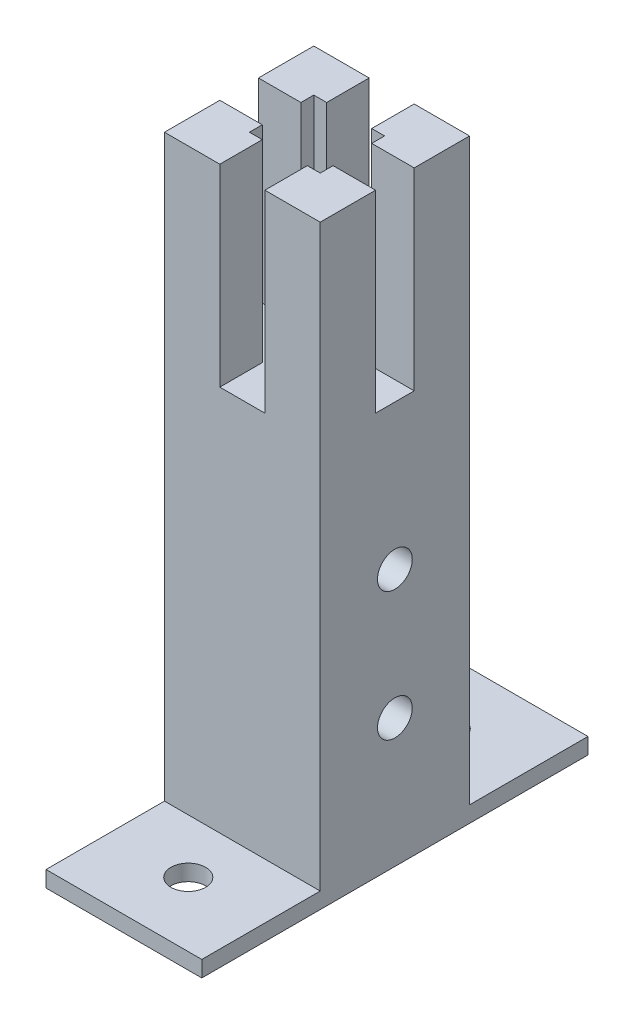
ISO-10303-21;
HEADER;
FILE_DESCRIPTION(('STEP AP214'),'2;1');
FILE_NAME('part.step','',(''),(''),'','','');
FILE_SCHEMA(('AUTOMOTIVE_DESIGN { 1 0 10303 214 1 1 1 1 }'));
ENDSEC;
DATA;
#1=APPLICATION_CONTEXT('core data for automotive mechanical design processes');
#2=APPLICATION_PROTOCOL_DEFINITION('international standard','automotive_design',2000,#1);
#3=PRODUCT_CONTEXT('',#1,'mechanical');
#4=PRODUCT('Part','Part','',(#3));
#5=PRODUCT_RELATED_PRODUCT_CATEGORY('part','',(#4));
#6=PRODUCT_DEFINITION_FORMATION('','',#4);
#7=PRODUCT_DEFINITION_CONTEXT('part definition',#1,'design');
#8=PRODUCT_DEFINITION('design','',#6,#7);
#9=PRODUCT_DEFINITION_SHAPE('','',#8);
#10=(LENGTH_UNIT() NAMED_UNIT(*) SI_UNIT(.MILLI.,.METRE.));
#11=(NAMED_UNIT(*) PLANE_ANGLE_UNIT() SI_UNIT($,.RADIAN.));
#12=(NAMED_UNIT(*) SI_UNIT($,.STERADIAN.) SOLID_ANGLE_UNIT());
#13=UNCERTAINTY_MEASURE_WITH_UNIT(LENGTH_MEASURE(1.E-05),#10,'distance_accuracy_value','');
#14=(GEOMETRIC_REPRESENTATION_CONTEXT(3) GLOBAL_UNCERTAINTY_ASSIGNED_CONTEXT((#13)) GLOBAL_UNIT_ASSIGNED_CONTEXT((#10,
#11,#12)) REPRESENTATION_CONTEXT('',''));
#15=CARTESIAN_POINT('',(0.,0.,0.));
#16=DIRECTION('',(0.,0.,1.));
#17=DIRECTION('',(1.,0.,0.));
#18=AXIS2_PLACEMENT_3D('',#15,#16,#17);
#19=CARTESIAN_POINT('',(0.,0.,0.));
#20=DIRECTION('',(0.,-1.,0.));
#21=DIRECTION('',(0.,0.,-1.));
#22=AXIS2_PLACEMENT_3D('',#19,#20,#21);
#23=PLANE('',#22);
#24=DIRECTION('',(0.,0.,1.));
#25=VECTOR('',#24,1.);
#26=CARTESIAN_POINT('',(4.445,0.,14.732));
#27=LINE('',#26,#25);
#28=CARTESIAN_POINT('',(4.445,0.,6.35));
#29=VERTEX_POINT('',#28);
#30=CARTESIAN_POINT('',(4.445,0.,14.732));
#31=VERTEX_POINT('',#30);
#32=EDGE_CURVE('E249',#29,#31,#27,.T.);
#33=ORIENTED_EDGE('',*,*,#32,.F.);
#34=DIRECTION('',(-1.,0.,0.));
#35=VECTOR('',#34,1.);
#36=CARTESIAN_POINT('',(4.445,0.,6.35));
#37=LINE('',#36,#35);
#38=CARTESIAN_POINT('',(6.985,0.,6.35));
#39=VERTEX_POINT('',#38);
#40=EDGE_CURVE('E246',#39,#29,#37,.T.);
#41=ORIENTED_EDGE('',*,*,#40,.F.);
#42=DIRECTION('',(0.,0.,1.));
#43=VECTOR('',#42,1.);
#44=CARTESIAN_POINT('',(6.985,0.,6.35));
#45=LINE('',#44,#43);
#46=CARTESIAN_POINT('',(6.985,0.,3.81));
#47=VERTEX_POINT('',#46);
#48=EDGE_CURVE('E259',#47,#39,#45,.T.);
#49=ORIENTED_EDGE('',*,*,#48,.F.);
#50=DIRECTION('',(-1.,0.,0.));
#51=VECTOR('',#50,1.);
#52=CARTESIAN_POINT('',(6.985,0.,3.81));
#53=LINE('',#52,#51);
#54=CARTESIAN_POINT('',(15.367,0.,3.81));
#55=VERTEX_POINT('',#54);
#56=EDGE_CURVE('E272',#55,#47,#53,.T.);
#57=ORIENTED_EDGE('',*,*,#56,.F.);
#58=DIRECTION('',(0.,0.,1.));
#59=VECTOR('',#58,1.);
#60=CARTESIAN_POINT('',(15.367,0.,14.732));
#61=LINE('',#60,#59);
#62=CARTESIAN_POINT('',(15.367,0.,-3.81));
#63=VERTEX_POINT('',#62);
#64=EDGE_CURVE('E372',#63,#55,#61,.T.);
#65=ORIENTED_EDGE('',*,*,#64,.F.);
#66=DIRECTION('',(1.,0.,0.));
#67=VECTOR('',#66,1.);
#68=CARTESIAN_POINT('',(6.985,0.,-3.81));
#69=LINE('',#68,#67);
#70=CARTESIAN_POINT('',(6.985,0.,-3.81));
#71=VERTEX_POINT('',#70);
#72=EDGE_CURVE('E402',#71,#63,#69,.T.);
#73=ORIENTED_EDGE('',*,*,#72,.F.);
#74=DIRECTION('',(0.,0.,1.));
#75=VECTOR('',#74,1.);
#76=CARTESIAN_POINT('',(6.985,0.,-6.35));
#77=LINE('',#76,#75);
#78=CARTESIAN_POINT('',(6.985,0.,-6.35));
#79=VERTEX_POINT('',#78);
#80=EDGE_CURVE('E399',#79,#71,#77,.T.);
#81=ORIENTED_EDGE('',*,*,#80,.F.);
#82=DIRECTION('',(1.,0.,0.));
#83=VECTOR('',#82,1.);
#84=CARTESIAN_POINT('',(4.445,0.,-6.35));
#85=LINE('',#84,#83);
#86=CARTESIAN_POINT('',(4.445,0.,-6.35));
#87=VERTEX_POINT('',#86);
#88=EDGE_CURVE('E381',#87,#79,#85,.T.);
#89=ORIENTED_EDGE('',*,*,#88,.F.);
#90=DIRECTION('',(0.,0.,1.));
#91=VECTOR('',#90,1.);
#92=CARTESIAN_POINT('',(4.445,0.,-14.732));
#93=LINE('',#92,#91);
#94=CARTESIAN_POINT('',(4.445,0.,-14.732));
#95=VERTEX_POINT('',#94);
#96=EDGE_CURVE('E386',#95,#87,#93,.T.);
#97=ORIENTED_EDGE('',*,*,#96,.F.);
#98=DIRECTION('',(1.,0.,0.));
#99=VECTOR('',#98,1.);
#100=CARTESIAN_POINT('',(-15.367,0.,-14.732));
#101=LINE('',#100,#99);
#102=CARTESIAN_POINT('',(-4.445,0.,-14.732));
#103=VERTEX_POINT('',#102);
#104=EDGE_CURVE('E370',#103,#95,#101,.T.);
#105=ORIENTED_EDGE('',*,*,#104,.F.);
#106=DIRECTION('',(0.,0.,-1.));
#107=VECTOR('',#106,1.);
#108=CARTESIAN_POINT('',(-4.445,0.,-14.732));
#109=LINE('',#108,#107);
#110=CARTESIAN_POINT('',(-4.445,0.,-6.35));
#111=VERTEX_POINT('',#110);
#112=EDGE_CURVE('E304',#111,#103,#109,.T.);
#113=ORIENTED_EDGE('',*,*,#112,.F.);
#114=DIRECTION('',(1.,0.,0.));
#115=VECTOR('',#114,1.);
#116=CARTESIAN_POINT('',(-4.445,0.,-6.35));
#117=LINE('',#116,#115);
#118=CARTESIAN_POINT('',(-6.985,0.,-6.35));
#119=VERTEX_POINT('',#118);
#120=EDGE_CURVE('E285',#119,#111,#117,.T.);
#121=ORIENTED_EDGE('',*,*,#120,.F.);
#122=DIRECTION('',(0.,0.,-1.));
#123=VECTOR('',#122,1.);
#124=CARTESIAN_POINT('',(-6.985,0.,-6.35));
#125=LINE('',#124,#123);
#126=CARTESIAN_POINT('',(-6.985,0.,-3.81));
#127=VERTEX_POINT('',#126);
#128=EDGE_CURVE('E290',#127,#119,#125,.T.);
#129=ORIENTED_EDGE('',*,*,#128,.F.);
#130=DIRECTION('',(1.,0.,0.));
#131=VECTOR('',#130,1.);
#132=CARTESIAN_POINT('',(-6.985,0.,-3.81));
#133=LINE('',#132,#131);
#134=CARTESIAN_POINT('',(-15.367,0.,-3.81));
#135=VERTEX_POINT('',#134);
#136=EDGE_CURVE('E306',#135,#127,#133,.T.);
#137=ORIENTED_EDGE('',*,*,#136,.F.);
#138=DIRECTION('',(0.,0.,-1.));
#139=VECTOR('',#138,1.);
#140=CARTESIAN_POINT('',(-15.367,0.,14.732));
#141=LINE('',#140,#139);
#142=CARTESIAN_POINT('',(-15.367,0.,3.81000000000001));
#143=VERTEX_POINT('',#142);
#144=EDGE_CURVE('E359',#143,#135,#141,.T.);
#145=ORIENTED_EDGE('',*,*,#144,.F.);
#146=DIRECTION('',(-1.,0.,0.));
#147=VECTOR('',#146,1.);
#148=CARTESIAN_POINT('',(-6.985,0.,3.81));
#149=LINE('',#148,#147);
#150=CARTESIAN_POINT('',(-6.985,0.,3.81));
#151=VERTEX_POINT('',#150);
#152=EDGE_CURVE('E56',#151,#143,#149,.T.);
#153=ORIENTED_EDGE('',*,*,#152,.F.);
#154=DIRECTION('',(0.,0.,-1.));
#155=VECTOR('',#154,1.);
#156=CARTESIAN_POINT('',(-6.985,0.,6.35));
#157=LINE('',#156,#155);
#158=CARTESIAN_POINT('',(-6.985,0.,6.35));
#159=VERTEX_POINT('',#158);
#160=EDGE_CURVE('E340',#159,#151,#157,.T.);
#161=ORIENTED_EDGE('',*,*,#160,.F.);
#162=DIRECTION('',(-1.,0.,0.));
#163=VECTOR('',#162,1.);
#164=CARTESIAN_POINT('',(-4.445,0.,6.35));
#165=LINE('',#164,#163);
#166=CARTESIAN_POINT('',(-4.445,0.,6.35));
#167=VERTEX_POINT('',#166);
#168=EDGE_CURVE('E321',#167,#159,#165,.T.);
#169=ORIENTED_EDGE('',*,*,#168,.F.);
#170=DIRECTION('',(0.,0.,-1.));
#171=VECTOR('',#170,1.);
#172=CARTESIAN_POINT('',(-4.445,0.,14.732));
#173=LINE('',#172,#171);
#174=CARTESIAN_POINT('',(-4.445,0.,14.732));
#175=VERTEX_POINT('',#174);
#176=EDGE_CURVE('E326',#175,#167,#173,.T.);
#177=ORIENTED_EDGE('',*,*,#176,.F.);
#178=DIRECTION('',(-1.,0.,0.));
#179=VECTOR('',#178,1.);
#180=CARTESIAN_POINT('',(-15.367,0.,14.732));
#181=LINE('',#180,#179);
#182=EDGE_CURVE('E364',#31,#175,#181,.T.);
#183=ORIENTED_EDGE('',*,*,#182,.F.);
#184=EDGE_LOOP('',(#33,#41,#49,#57,#65,#73,#81,#89,#97,#105,#113,#121,#129,#137,#145,#153,#161,
#169,#177,#183));
#185=FACE_BOUND('',#184,.T.);
#186=ADVANCED_FACE('F33',(#185),#23,.F.);
#187=CARTESIAN_POINT('',(4.445,38.1,-6.35));
#188=DIRECTION('',(0.,0.,-1.));
#189=DIRECTION('',(-1.,0.,0.));
#190=AXIS2_PLACEMENT_3D('',#187,#188,#189);
#191=PLANE('',#190);
#192=ORIENTED_EDGE('',*,*,#88,.T.);
#193=DIRECTION('',(0.,-1.,0.));
#194=VECTOR('',#193,1.);
#195=CARTESIAN_POINT('',(6.985,38.1,-6.35));
#196=LINE('',#195,#194);
#197=CARTESIAN_POINT('',(6.985,38.1,-6.35));
#198=VERTEX_POINT('',#197);
#199=EDGE_CURVE('E11',#198,#79,#196,.T.);
#200=ORIENTED_EDGE('',*,*,#199,.F.);
#201=DIRECTION('',(1.,0.,0.));
#202=VECTOR('',#201,1.);
#203=CARTESIAN_POINT('',(4.445,38.1,-6.35));
#204=LINE('',#203,#202);
#205=CARTESIAN_POINT('',(4.445,38.1,-6.35));
#206=VERTEX_POINT('',#205);
#207=EDGE_CURVE('E382',#206,#198,#204,.T.);
#208=ORIENTED_EDGE('',*,*,#207,.F.);
#209=DIRECTION('',(0.,-1.,0.));
#210=VECTOR('',#209,1.);
#211=CARTESIAN_POINT('',(4.445,38.1,-6.35));
#212=LINE('',#211,#210);
#213=EDGE_CURVE('E396',#206,#87,#212,.T.);
#214=ORIENTED_EDGE('',*,*,#213,.T.);
#215=EDGE_LOOP('',(#192,#200,#208,#214));
#216=FACE_BOUND('',#215,.T.);
#217=ADVANCED_FACE('F35',(#216),#191,.F.);
#218=CARTESIAN_POINT('',(6.985,38.1,-6.35));
#219=DIRECTION('',(1.,0.,0.));
#220=DIRECTION('',(0.,0.,-1.));
#221=AXIS2_PLACEMENT_3D('',#218,#219,#220);
#222=PLANE('',#221);
#223=ORIENTED_EDGE('',*,*,#80,.T.);
#224=DIRECTION('',(0.,-1.,0.));
#225=VECTOR('',#224,1.);
#226=CARTESIAN_POINT('',(6.985,38.1,-3.81));
#227=LINE('',#226,#225);
#228=CARTESIAN_POINT('',(6.985,38.1,-3.81));
#229=VERTEX_POINT('',#228);
#230=EDGE_CURVE('E41',#229,#71,#227,.T.);
#231=ORIENTED_EDGE('',*,*,#230,.F.);
#232=DIRECTION('',(0.,0.,1.));
#233=VECTOR('',#232,1.);
#234=CARTESIAN_POINT('',(6.985,38.1,-6.35));
#235=LINE('',#234,#233);
#236=EDGE_CURVE('E385',#198,#229,#235,.T.);
#237=ORIENTED_EDGE('',*,*,#236,.F.);
#238=ORIENTED_EDGE('',*,*,#199,.T.);
#239=EDGE_LOOP('',(#223,#231,#237,#238));
#240=FACE_BOUND('',#239,.T.);
#241=ADVANCED_FACE('F423',(#240),#222,.F.);
#242=CARTESIAN_POINT('',(6.985,38.1,-3.81));
#243=DIRECTION('',(0.,0.,-1.));
#244=DIRECTION('',(-1.,0.,0.));
#245=AXIS2_PLACEMENT_3D('',#242,#243,#244);
#246=PLANE('',#245);
#247=ORIENTED_EDGE('',*,*,#72,.T.);
#248=DIRECTION('',(0.,-1.,0.));
#249=VECTOR('',#248,1.);
#250=CARTESIAN_POINT('',(15.367,38.1,-3.81));
#251=LINE('',#250,#249);
#252=CARTESIAN_POINT('',(15.367,38.1,-3.81));
#253=VERTEX_POINT('',#252);
#254=EDGE_CURVE('E414',#253,#63,#251,.T.);
#255=ORIENTED_EDGE('',*,*,#254,.F.);
#256=DIRECTION('',(1.,0.,0.));
#257=VECTOR('',#256,1.);
#258=CARTESIAN_POINT('',(6.985,38.1,-3.81));
#259=LINE('',#258,#257);
#260=EDGE_CURVE('E388',#229,#253,#259,.T.);
#261=ORIENTED_EDGE('',*,*,#260,.F.);
#262=ORIENTED_EDGE('',*,*,#230,.T.);
#263=EDGE_LOOP('',(#247,#255,#261,#262));
#264=FACE_BOUND('',#263,.T.);
#265=ADVANCED_FACE('F420',(#264),#246,.F.);
#266=CARTESIAN_POINT('',(15.367,38.1,-3.81));
#267=DIRECTION('',(-1.,0.,0.));
#268=DIRECTION('',(0.,0.,1.));
#269=AXIS2_PLACEMENT_3D('',#266,#267,#268);
#270=PLANE('',#269);
#271=CARTESIAN_POINT('',(15.367,-28.575,0.));
#272=DIRECTION('',(1.,0.,0.));
#273=DIRECTION('',(0.,0.,-1.));
#274=AXIS2_PLACEMENT_3D('',#271,#272,#273);
#275=CIRCLE('',#274,3.429);
#276=CARTESIAN_POINT('',(15.367,-28.575,-3.429));
#277=VERTEX_POINT('',#276);
#278=EDGE_CURVE('E560',#277,#277,#275,.T.);
#279=ORIENTED_EDGE('',*,*,#278,.F.);
#280=EDGE_LOOP('',(#279));
#281=FACE_BOUND('',#280,.T.);
#282=CARTESIAN_POINT('',(15.367,-53.975,0.));
#283=DIRECTION('',(1.,0.,0.));
#284=DIRECTION('',(0.,0.,-1.));
#285=AXIS2_PLACEMENT_3D('',#282,#283,#284);
#286=CIRCLE('',#285,3.429);
#287=CARTESIAN_POINT('',(15.367,-53.975,-3.429));
#288=VERTEX_POINT('',#287);
#289=EDGE_CURVE('E554',#288,#288,#286,.T.);
#290=ORIENTED_EDGE('',*,*,#289,.F.);
#291=EDGE_LOOP('',(#290));
#292=FACE_BOUND('',#291,.T.);
#293=ORIENTED_EDGE('',*,*,#254,.T.);
#294=ORIENTED_EDGE('',*,*,#64,.T.);
#295=DIRECTION('',(0.,-1.,0.));
#296=VECTOR('',#295,1.);
#297=CARTESIAN_POINT('',(15.367,38.1,3.81));
#298=LINE('',#297,#296);
#299=CARTESIAN_POINT('',(15.367,38.1,3.81));
#300=VERTEX_POINT('',#299);
#301=EDGE_CURVE('E280',#300,#55,#298,.T.);
#302=ORIENTED_EDGE('',*,*,#301,.F.);
#303=DIRECTION('',(0.,0.,-1.));
#304=VECTOR('',#303,1.);
#305=CARTESIAN_POINT('',(15.367,38.1,3.81));
#306=LINE('',#305,#304);
#307=CARTESIAN_POINT('',(15.367,38.1,14.732));
#308=VERTEX_POINT('',#307);
#309=EDGE_CURVE('E264',#308,#300,#306,.T.);
#310=ORIENTED_EDGE('',*,*,#309,.F.);
#311=DIRECTION('',(0.,1.,0.));
#312=VECTOR('',#311,1.);
#313=CARTESIAN_POINT('',(15.367,-76.2,14.732));
#314=LINE('',#313,#312);
#315=CARTESIAN_POINT('',(15.367,-76.2,14.732));
#316=VERTEX_POINT('',#315);
#317=EDGE_CURVE('E377',#316,#308,#314,.T.);
#318=ORIENTED_EDGE('',*,*,#317,.F.);
#319=DIRECTION('',(0.,0.,1.));
#320=VECTOR('',#319,1.);
#321=CARTESIAN_POINT('',(15.367,-76.2,38.1));
#322=LINE('',#321,#320);
#323=CARTESIAN_POINT('',(15.367,-76.2,38.1));
#324=VERTEX_POINT('',#323);
#325=EDGE_CURVE('E514',#316,#324,#322,.T.);
#326=ORIENTED_EDGE('',*,*,#325,.T.);
#327=DIRECTION('',(0.,1.,0.));
#328=VECTOR('',#327,1.);
#329=CARTESIAN_POINT('',(15.367,-79.375,38.1));
#330=LINE('',#329,#328);
#331=CARTESIAN_POINT('',(15.367,-79.375,38.1));
#332=VERTEX_POINT('',#331);
#333=EDGE_CURVE('E251',#332,#324,#330,.T.);
#334=ORIENTED_EDGE('',*,*,#333,.F.);
#335=DIRECTION('',(0.,0.,1.));
#336=VECTOR('',#335,1.);
#337=CARTESIAN_POINT('',(15.367,-79.375,38.1));
#338=LINE('',#337,#336);
#339=CARTESIAN_POINT('',(15.367,-79.375,-38.1));
#340=VERTEX_POINT('',#339);
#341=EDGE_CURVE('E228',#340,#332,#338,.T.);
#342=ORIENTED_EDGE('',*,*,#341,.F.);
#343=DIRECTION('',(0.,1.,0.));
#344=VECTOR('',#343,1.);
#345=CARTESIAN_POINT('',(15.367,-79.375,-38.1));
#346=LINE('',#345,#344);
#347=CARTESIAN_POINT('',(15.367,-76.2,-38.1));
#348=VERTEX_POINT('',#347);
#349=EDGE_CURVE('E225',#340,#348,#346,.T.);
#350=ORIENTED_EDGE('',*,*,#349,.T.);
#351=CARTESIAN_POINT('',(15.367,-76.2,-14.732));
#352=VERTEX_POINT('',#351);
#353=EDGE_CURVE('E522',#348,#352,#322,.T.);
#354=ORIENTED_EDGE('',*,*,#353,.T.);
#355=DIRECTION('',(0.,-1.,0.));
#356=VECTOR('',#355,1.);
#357=CARTESIAN_POINT('',(15.367,38.1,-14.732));
#358=LINE('',#357,#356);
#359=CARTESIAN_POINT('',(15.367,38.1,-14.732));
#360=VERTEX_POINT('',#359);
#361=EDGE_CURVE('E412',#360,#352,#358,.T.);
#362=ORIENTED_EDGE('',*,*,#361,.F.);
#363=DIRECTION('',(0.,0.,-1.));
#364=VECTOR('',#363,1.);
#365=CARTESIAN_POINT('',(15.367,38.1,-3.81));
#366=LINE('',#365,#364);
#367=EDGE_CURVE('E390',#253,#360,#366,.T.);
#368=ORIENTED_EDGE('',*,*,#367,.F.);
#369=EDGE_LOOP('',(#293,#294,#302,#310,#318,#326,#334,#342,#350,#354,#362,#368));
#370=FACE_BOUND('',#369,.T.);
#371=ADVANCED_FACE('F431',(#281,#292,#370),#270,.F.);
#372=CARTESIAN_POINT('',(15.367,38.1,-14.732));
#373=DIRECTION('',(0.,0.,1.));
#374=DIRECTION('',(1.,0.,0.));
#375=AXIS2_PLACEMENT_3D('',#372,#373,#374);
#376=PLANE('',#375);
#377=ORIENTED_EDGE('',*,*,#361,.T.);
#378=DIRECTION('',(1.,0.,0.));
#379=VECTOR('',#378,1.);
#380=CARTESIAN_POINT('',(-15.367,-76.2,-14.732));
#381=LINE('',#380,#379);
#382=CARTESIAN_POINT('',(-15.367,-76.2,-14.732));
#383=VERTEX_POINT('',#382);
#384=EDGE_CURVE('E360',#383,#352,#381,.T.);
#385=ORIENTED_EDGE('',*,*,#384,.F.);
#386=DIRECTION('',(0.,1.,0.));
#387=VECTOR('',#386,1.);
#388=CARTESIAN_POINT('',(-15.367,-76.2,-14.732));
#389=LINE('',#388,#387);
#390=CARTESIAN_POINT('',(-15.367,38.1,-14.732));
#391=VERTEX_POINT('',#390);
#392=EDGE_CURVE('E379',#383,#391,#389,.T.);
#393=ORIENTED_EDGE('',*,*,#392,.T.);
#394=DIRECTION('',(-1.,0.,0.));
#395=VECTOR('',#394,1.);
#396=CARTESIAN_POINT('',(-15.367,38.1,-14.732));
#397=LINE('',#396,#395);
#398=CARTESIAN_POINT('',(-4.445,38.1,-14.732));
#399=VERTEX_POINT('',#398);
#400=EDGE_CURVE('E292',#399,#391,#397,.T.);
#401=ORIENTED_EDGE('',*,*,#400,.F.);
#402=DIRECTION('',(0.,-1.,0.));
#403=VECTOR('',#402,1.);
#404=CARTESIAN_POINT('',(-4.445,38.1,-14.732));
#405=LINE('',#404,#403);
#406=EDGE_CURVE('E316',#399,#103,#405,.T.);
#407=ORIENTED_EDGE('',*,*,#406,.T.);
#408=ORIENTED_EDGE('',*,*,#104,.T.);
#409=DIRECTION('',(0.,-1.,0.));
#410=VECTOR('',#409,1.);
#411=CARTESIAN_POINT('',(4.445,38.1,-14.732));
#412=LINE('',#411,#410);
#413=CARTESIAN_POINT('',(4.445,38.1,-14.732));
#414=VERTEX_POINT('',#413);
#415=EDGE_CURVE('E409',#414,#95,#412,.T.);
#416=ORIENTED_EDGE('',*,*,#415,.F.);
#417=DIRECTION('',(-1.,0.,0.));
#418=VECTOR('',#417,1.);
#419=CARTESIAN_POINT('',(15.367,38.1,-14.732));
#420=LINE('',#419,#418);
#421=EDGE_CURVE('E392',#360,#414,#420,.T.);
#422=ORIENTED_EDGE('',*,*,#421,.F.);
#423=EDGE_LOOP('',(#377,#385,#393,#401,#407,#408,#416,#422));
#424=FACE_BOUND('',#423,.T.);
#425=ADVANCED_FACE('F451',(#424),#376,.F.);
#426=CARTESIAN_POINT('',(4.445,38.1,-14.732));
#427=DIRECTION('',(1.,0.,0.));
#428=DIRECTION('',(0.,0.,-1.));
#429=AXIS2_PLACEMENT_3D('',#426,#427,#428);
#430=PLANE('',#429);
#431=ORIENTED_EDGE('',*,*,#96,.T.);
#432=ORIENTED_EDGE('',*,*,#213,.F.);
#433=DIRECTION('',(0.,0.,1.));
#434=VECTOR('',#433,1.);
#435=CARTESIAN_POINT('',(4.445,38.1,-14.732));
#436=LINE('',#435,#434);
#437=EDGE_CURVE('E394',#414,#206,#436,.T.);
#438=ORIENTED_EDGE('',*,*,#437,.F.);
#439=ORIENTED_EDGE('',*,*,#415,.T.);
#440=EDGE_LOOP('',(#431,#432,#438,#439));
#441=FACE_BOUND('',#440,.T.);
#442=ADVANCED_FACE('F446',(#441),#430,.F.);
#443=CARTESIAN_POINT('',(0.,38.1,0.));
#444=DIRECTION('',(0.,-1.,0.));
#445=DIRECTION('',(0.,0.,-1.));
#446=AXIS2_PLACEMENT_3D('',#443,#444,#445);
#447=PLANE('',#446);
#448=ORIENTED_EDGE('',*,*,#207,.T.);
#449=ORIENTED_EDGE('',*,*,#236,.T.);
#450=ORIENTED_EDGE('',*,*,#260,.T.);
#451=ORIENTED_EDGE('',*,*,#367,.T.);
#452=ORIENTED_EDGE('',*,*,#421,.T.);
#453=ORIENTED_EDGE('',*,*,#437,.T.);
#454=EDGE_LOOP('',(#448,#449,#450,#451,#452,#453));
#455=FACE_BOUND('',#454,.T.);
#456=ADVANCED_FACE('F439',(#455),#447,.F.);
#457=CARTESIAN_POINT('',(-15.367,-76.2,14.732));
#458=DIRECTION('',(1.,0.,0.));
#459=DIRECTION('',(0.,0.,-1.));
#460=AXIS2_PLACEMENT_3D('',#457,#458,#459);
#461=PLANE('',#460);
#462=CARTESIAN_POINT('',(-15.367,-28.575,0.));
#463=DIRECTION('',(1.,0.,0.));
#464=DIRECTION('',(0.,0.,-1.));
#465=AXIS2_PLACEMENT_3D('',#462,#463,#464);
#466=CIRCLE('',#465,3.429);
#467=CARTESIAN_POINT('',(-15.367,-28.575,-3.429));
#468=VERTEX_POINT('',#467);
#469=EDGE_CURVE('E557',#468,#468,#466,.T.);
#470=ORIENTED_EDGE('',*,*,#469,.T.);
#471=EDGE_LOOP('',(#470));
#472=FACE_BOUND('',#471,.T.);
#473=CARTESIAN_POINT('',(-15.367,-53.975,0.));
#474=DIRECTION('',(1.,0.,0.));
#475=DIRECTION('',(0.,0.,-1.));
#476=AXIS2_PLACEMENT_3D('',#473,#474,#475);
#477=CIRCLE('',#476,3.429);
#478=CARTESIAN_POINT('',(-15.367,-53.975,-3.429));
#479=VERTEX_POINT('',#478);
#480=EDGE_CURVE('E549',#479,#479,#477,.T.);
#481=ORIENTED_EDGE('',*,*,#480,.T.);
#482=EDGE_LOOP('',(#481));
#483=FACE_BOUND('',#482,.T.);
#484=DIRECTION('',(0.,1.,0.));
#485=VECTOR('',#484,1.);
#486=CARTESIAN_POINT('',(-15.367,-76.2,14.732));
#487=LINE('',#486,#485);
#488=CARTESIAN_POINT('',(-15.367,-76.2,14.732));
#489=VERTEX_POINT('',#488);
#490=CARTESIAN_POINT('',(-15.367,38.1,14.732));
#491=VERTEX_POINT('',#490);
#492=EDGE_CURVE('E367',#489,#491,#487,.T.);
#493=ORIENTED_EDGE('',*,*,#492,.T.);
#494=DIRECTION('',(0.,0.,1.));
#495=VECTOR('',#494,1.);
#496=CARTESIAN_POINT('',(-15.367,38.1,3.81000000000001));
#497=LINE('',#496,#495);
#498=CARTESIAN_POINT('',(-15.367,38.1,3.81000000000001));
#499=VERTEX_POINT('',#498);
#500=EDGE_CURVE('E330',#499,#491,#497,.T.);
#501=ORIENTED_EDGE('',*,*,#500,.F.);
#502=DIRECTION('',(0.,-1.,0.));
#503=VECTOR('',#502,1.);
#504=CARTESIAN_POINT('',(-15.367,38.1,3.81000000000001));
#505=LINE('',#504,#503);
#506=EDGE_CURVE('E350',#499,#143,#505,.T.);
#507=ORIENTED_EDGE('',*,*,#506,.T.);
#508=ORIENTED_EDGE('',*,*,#144,.T.);
#509=DIRECTION('',(0.,-1.,0.));
#510=VECTOR('',#509,1.);
#511=CARTESIAN_POINT('',(-15.367,38.1,-3.81));
#512=LINE('',#511,#510);
#513=CARTESIAN_POINT('',(-15.367,38.1,-3.81));
#514=VERTEX_POINT('',#513);
#515=EDGE_CURVE('E314',#514,#135,#512,.T.);
#516=ORIENTED_EDGE('',*,*,#515,.F.);
#517=DIRECTION('',(0.,0.,1.));
#518=VECTOR('',#517,1.);
#519=CARTESIAN_POINT('',(-15.367,38.1,-3.81));
#520=LINE('',#519,#518);
#521=EDGE_CURVE('E295',#391,#514,#520,.T.);
#522=ORIENTED_EDGE('',*,*,#521,.F.);
#523=ORIENTED_EDGE('',*,*,#392,.F.);
#524=DIRECTION('',(0.,0.,-1.));
#525=VECTOR('',#524,1.);
#526=CARTESIAN_POINT('',(-15.367,-76.2,38.1));
#527=LINE('',#526,#525);
#528=CARTESIAN_POINT('',(-15.367,-76.2,-38.1));
#529=VERTEX_POINT('',#528);
#530=EDGE_CURVE('E244',#383,#529,#527,.T.);
#531=ORIENTED_EDGE('',*,*,#530,.T.);
#532=DIRECTION('',(0.,1.,0.));
#533=VECTOR('',#532,1.);
#534=CARTESIAN_POINT('',(-15.367,-79.375,-38.1));
#535=LINE('',#534,#533);
#536=CARTESIAN_POINT('',(-15.367,-79.375,-38.1));
#537=VERTEX_POINT('',#536);
#538=EDGE_CURVE('E223',#537,#529,#535,.T.);
#539=ORIENTED_EDGE('',*,*,#538,.F.);
#540=DIRECTION('',(0.,0.,-1.));
#541=VECTOR('',#540,1.);
#542=CARTESIAN_POINT('',(-15.367,-79.375,38.1));
#543=LINE('',#542,#541);
#544=CARTESIAN_POINT('',(-15.367,-79.375,38.1));
#545=VERTEX_POINT('',#544);
#546=EDGE_CURVE('E229',#545,#537,#543,.T.);
#547=ORIENTED_EDGE('',*,*,#546,.F.);
#548=DIRECTION('',(0.,1.,0.));
#549=VECTOR('',#548,1.);
#550=CARTESIAN_POINT('',(-15.367,-79.375,38.1));
#551=LINE('',#550,#549);
#552=CARTESIAN_POINT('',(-15.367,-76.2,38.1));
#553=VERTEX_POINT('',#552);
#554=EDGE_CURVE('E530',#545,#553,#551,.T.);
#555=ORIENTED_EDGE('',*,*,#554,.T.);
#556=EDGE_CURVE('E525',#553,#489,#527,.T.);
#557=ORIENTED_EDGE('',*,*,#556,.T.);
#558=EDGE_LOOP('',(#493,#501,#507,#508,#516,#522,#523,#531,#539,#547,#555,#557));
#559=FACE_BOUND('',#558,.T.);
#560=ADVANCED_FACE('F241',(#472,#483,#559),#461,.F.);
#561=CARTESIAN_POINT('',(-15.367,-76.2,14.732));
#562=DIRECTION('',(0.,0.,-1.));
#563=DIRECTION('',(-1.,0.,0.));
#564=AXIS2_PLACEMENT_3D('',#561,#562,#563);
#565=PLANE('',#564);
#566=ORIENTED_EDGE('',*,*,#317,.T.);
#567=DIRECTION('',(1.,0.,0.));
#568=VECTOR('',#567,1.);
#569=CARTESIAN_POINT('',(15.367,38.1,14.732));
#570=LINE('',#569,#568);
#571=CARTESIAN_POINT('',(4.445,38.1,14.732));
#572=VERTEX_POINT('',#571);
#573=EDGE_CURVE('E261',#572,#308,#570,.T.);
#574=ORIENTED_EDGE('',*,*,#573,.F.);
#575=DIRECTION('',(0.,-1.,0.));
#576=VECTOR('',#575,1.);
#577=CARTESIAN_POINT('',(4.445,38.1,14.732));
#578=LINE('',#577,#576);
#579=EDGE_CURVE('E48',#572,#31,#578,.T.);
#580=ORIENTED_EDGE('',*,*,#579,.T.);
#581=ORIENTED_EDGE('',*,*,#182,.T.);
#582=DIRECTION('',(0.,-1.,0.));
#583=VECTOR('',#582,1.);
#584=CARTESIAN_POINT('',(-4.445,38.1,14.732));
#585=LINE('',#584,#583);
#586=CARTESIAN_POINT('',(-4.445,38.1,14.732));
#587=VERTEX_POINT('',#586);
#588=EDGE_CURVE('E347',#587,#175,#585,.T.);
#589=ORIENTED_EDGE('',*,*,#588,.F.);
#590=DIRECTION('',(1.,0.,0.));
#591=VECTOR('',#590,1.);
#592=CARTESIAN_POINT('',(-15.367,38.1,14.732));
#593=LINE('',#592,#591);
#594=EDGE_CURVE('E333',#491,#587,#593,.T.);
#595=ORIENTED_EDGE('',*,*,#594,.F.);
#596=ORIENTED_EDGE('',*,*,#492,.F.);
#597=DIRECTION('',(-1.,0.,0.));
#598=VECTOR('',#597,1.);
#599=CARTESIAN_POINT('',(-15.367,-76.2,14.732));
#600=LINE('',#599,#598);
#601=EDGE_CURVE('E363',#316,#489,#600,.T.);
#602=ORIENTED_EDGE('',*,*,#601,.F.);
#603=EDGE_LOOP('',(#566,#574,#580,#581,#589,#595,#596,#602));
#604=FACE_BOUND('',#603,.T.);
#605=ADVANCED_FACE('F494',(#604),#565,.F.);
#606=CARTESIAN_POINT('',(-4.445,38.1,6.35));
#607=DIRECTION('',(0.,0.,1.));
#608=DIRECTION('',(1.,0.,0.));
#609=AXIS2_PLACEMENT_3D('',#606,#607,#608);
#610=PLANE('',#609);
#611=ORIENTED_EDGE('',*,*,#168,.T.);
#612=DIRECTION('',(0.,-1.,0.));
#613=VECTOR('',#612,1.);
#614=CARTESIAN_POINT('',(-6.985,38.1,6.35));
#615=LINE('',#614,#613);
#616=CARTESIAN_POINT('',(-6.985,38.1,6.35));
#617=VERTEX_POINT('',#616);
#618=EDGE_CURVE('E356',#617,#159,#615,.T.);
#619=ORIENTED_EDGE('',*,*,#618,.F.);
#620=DIRECTION('',(-1.,0.,0.));
#621=VECTOR('',#620,1.);
#622=CARTESIAN_POINT('',(-4.445,38.1,6.35));
#623=LINE('',#622,#621);
#624=CARTESIAN_POINT('',(-4.445,38.1,6.35));
#625=VERTEX_POINT('',#624);
#626=EDGE_CURVE('E322',#625,#617,#623,.T.);
#627=ORIENTED_EDGE('',*,*,#626,.F.);
#628=DIRECTION('',(0.,-1.,0.));
#629=VECTOR('',#628,1.);
#630=CARTESIAN_POINT('',(-4.445,38.1,6.35));
#631=LINE('',#630,#629);
#632=EDGE_CURVE('E337',#625,#167,#631,.T.);
#633=ORIENTED_EDGE('',*,*,#632,.T.);
#634=EDGE_LOOP('',(#611,#619,#627,#633));
#635=FACE_BOUND('',#634,.T.);
#636=ADVANCED_FACE('F490',(#635),#610,.F.);
#637=CARTESIAN_POINT('',(-6.985,38.1,6.35));
#638=DIRECTION('',(-1.,0.,0.));
#639=DIRECTION('',(0.,0.,1.));
#640=AXIS2_PLACEMENT_3D('',#637,#638,#639);
#641=PLANE('',#640);
#642=ORIENTED_EDGE('',*,*,#160,.T.);
#643=DIRECTION('',(0.,-1.,0.));
#644=VECTOR('',#643,1.);
#645=CARTESIAN_POINT('',(-6.985,38.1,3.81));
#646=LINE('',#645,#644);
#647=CARTESIAN_POINT('',(-6.985,38.1,3.81));
#648=VERTEX_POINT('',#647);
#649=EDGE_CURVE('E353',#648,#151,#646,.T.);
#650=ORIENTED_EDGE('',*,*,#649,.F.);
#651=DIRECTION('',(0.,0.,-1.));
#652=VECTOR('',#651,1.);
#653=CARTESIAN_POINT('',(-6.985,38.1,6.35));
#654=LINE('',#653,#652);
#655=EDGE_CURVE('E325',#617,#648,#654,.T.);
#656=ORIENTED_EDGE('',*,*,#655,.F.);
#657=ORIENTED_EDGE('',*,*,#618,.T.);
#658=EDGE_LOOP('',(#642,#650,#656,#657));
#659=FACE_BOUND('',#658,.T.);
#660=ADVANCED_FACE('F479',(#659),#641,.F.);
#661=CARTESIAN_POINT('',(-6.985,38.1,3.81));
#662=DIRECTION('',(0.,0.,1.));
#663=DIRECTION('',(1.,0.,0.));
#664=AXIS2_PLACEMENT_3D('',#661,#662,#663);
#665=PLANE('',#664);
#666=ORIENTED_EDGE('',*,*,#152,.T.);
#667=ORIENTED_EDGE('',*,*,#506,.F.);
#668=DIRECTION('',(-1.,0.,0.));
#669=VECTOR('',#668,1.);
#670=CARTESIAN_POINT('',(-6.985,38.1,3.81));
#671=LINE('',#670,#669);
#672=EDGE_CURVE('E328',#648,#499,#671,.T.);
#673=ORIENTED_EDGE('',*,*,#672,.F.);
#674=ORIENTED_EDGE('',*,*,#649,.T.);
#675=EDGE_LOOP('',(#666,#667,#673,#674));
#676=FACE_BOUND('',#675,.T.);
#677=ADVANCED_FACE('F475',(#676),#665,.F.);
#678=CARTESIAN_POINT('',(-4.445,38.1,14.732));
#679=DIRECTION('',(-1.,0.,0.));
#680=DIRECTION('',(0.,0.,1.));
#681=AXIS2_PLACEMENT_3D('',#678,#679,#680);
#682=PLANE('',#681);
#683=ORIENTED_EDGE('',*,*,#176,.T.);
#684=ORIENTED_EDGE('',*,*,#632,.F.);
#685=DIRECTION('',(0.,0.,-1.));
#686=VECTOR('',#685,1.);
#687=CARTESIAN_POINT('',(-4.445,38.1,14.732));
#688=LINE('',#687,#686);
#689=EDGE_CURVE('E335',#587,#625,#688,.T.);
#690=ORIENTED_EDGE('',*,*,#689,.F.);
#691=ORIENTED_EDGE('',*,*,#588,.T.);
#692=EDGE_LOOP('',(#683,#684,#690,#691));
#693=FACE_BOUND('',#692,.T.);
#694=ADVANCED_FACE('F486',(#693),#682,.F.);
#695=CARTESIAN_POINT('',(0.,38.1,0.));
#696=DIRECTION('',(0.,-1.,0.));
#697=DIRECTION('',(0.,0.,-1.));
#698=AXIS2_PLACEMENT_3D('',#695,#696,#697);
#699=PLANE('',#698);
#700=ORIENTED_EDGE('',*,*,#626,.T.);
#701=ORIENTED_EDGE('',*,*,#655,.T.);
#702=ORIENTED_EDGE('',*,*,#672,.T.);
#703=ORIENTED_EDGE('',*,*,#500,.T.);
#704=ORIENTED_EDGE('',*,*,#594,.T.);
#705=ORIENTED_EDGE('',*,*,#689,.T.);
#706=EDGE_LOOP('',(#700,#701,#702,#703,#704,#705));
#707=FACE_BOUND('',#706,.T.);
#708=ADVANCED_FACE('F492',(#707),#699,.F.);
#709=CARTESIAN_POINT('',(-4.445,38.1,-6.35));
#710=DIRECTION('',(0.,0.,-1.));
#711=DIRECTION('',(-1.,0.,0.));
#712=AXIS2_PLACEMENT_3D('',#709,#710,#711);
#713=PLANE('',#712);
#714=ORIENTED_EDGE('',*,*,#120,.T.);
#715=DIRECTION('',(0.,-1.,0.));
#716=VECTOR('',#715,1.);
#717=CARTESIAN_POINT('',(-4.445,38.1,-6.35));
#718=LINE('',#717,#716);
#719=CARTESIAN_POINT('',(-4.445,38.1,-6.35));
#720=VERTEX_POINT('',#719);
#721=EDGE_CURVE('E319',#720,#111,#718,.T.);
#722=ORIENTED_EDGE('',*,*,#721,.F.);
#723=DIRECTION('',(1.,0.,0.));
#724=VECTOR('',#723,1.);
#725=CARTESIAN_POINT('',(-4.445,38.1,-6.35));
#726=LINE('',#725,#724);
#727=CARTESIAN_POINT('',(-6.985,38.1,-6.35));
#728=VERTEX_POINT('',#727);
#729=EDGE_CURVE('E286',#728,#720,#726,.T.);
#730=ORIENTED_EDGE('',*,*,#729,.F.);
#731=DIRECTION('',(0.,-1.,0.));
#732=VECTOR('',#731,1.);
#733=CARTESIAN_POINT('',(-6.985,38.1,-6.35));
#734=LINE('',#733,#732);
#735=EDGE_CURVE('E301',#728,#119,#734,.T.);
#736=ORIENTED_EDGE('',*,*,#735,.T.);
#737=EDGE_LOOP('',(#714,#722,#730,#736));
#738=FACE_BOUND('',#737,.T.);
#739=ADVANCED_FACE('F459',(#738),#713,.F.);
#740=CARTESIAN_POINT('',(-4.445,38.1,-14.732));
#741=DIRECTION('',(-1.,0.,0.));
#742=DIRECTION('',(0.,0.,1.));
#743=AXIS2_PLACEMENT_3D('',#740,#741,#742);
#744=PLANE('',#743);
#745=ORIENTED_EDGE('',*,*,#112,.T.);
#746=ORIENTED_EDGE('',*,*,#406,.F.);
#747=DIRECTION('',(0.,0.,-1.));
#748=VECTOR('',#747,1.);
#749=CARTESIAN_POINT('',(-4.445,38.1,-14.732));
#750=LINE('',#749,#748);
#751=EDGE_CURVE('E289',#720,#399,#750,.T.);
#752=ORIENTED_EDGE('',*,*,#751,.F.);
#753=ORIENTED_EDGE('',*,*,#721,.T.);
#754=EDGE_LOOP('',(#745,#746,#752,#753));
#755=FACE_BOUND('',#754,.T.);
#756=ADVANCED_FACE('F455',(#755),#744,.F.);
#757=CARTESIAN_POINT('',(-6.985,38.1,-3.81));
#758=DIRECTION('',(0.,0.,-1.));
#759=DIRECTION('',(-1.,0.,0.));
#760=AXIS2_PLACEMENT_3D('',#757,#758,#759);
#761=PLANE('',#760);
#762=ORIENTED_EDGE('',*,*,#136,.T.);
#763=DIRECTION('',(0.,-1.,0.));
#764=VECTOR('',#763,1.);
#765=CARTESIAN_POINT('',(-6.985,38.1,-3.81));
#766=LINE('',#765,#764);
#767=CARTESIAN_POINT('',(-6.985,38.1,-3.81));
#768=VERTEX_POINT('',#767);
#769=EDGE_CURVE('E311',#768,#127,#766,.T.);
#770=ORIENTED_EDGE('',*,*,#769,.F.);
#771=DIRECTION('',(1.,0.,0.));
#772=VECTOR('',#771,1.);
#773=CARTESIAN_POINT('',(-6.985,38.1,-3.81));
#774=LINE('',#773,#772);
#775=EDGE_CURVE('E297',#514,#768,#774,.T.);
#776=ORIENTED_EDGE('',*,*,#775,.F.);
#777=ORIENTED_EDGE('',*,*,#515,.T.);
#778=EDGE_LOOP('',(#762,#770,#776,#777));
#779=FACE_BOUND('',#778,.T.);
#780=ADVANCED_FACE('F469',(#779),#761,.F.);
#781=CARTESIAN_POINT('',(-6.985,38.1,-6.35));
#782=DIRECTION('',(-1.,0.,0.));
#783=DIRECTION('',(0.,0.,1.));
#784=AXIS2_PLACEMENT_3D('',#781,#782,#783);
#785=PLANE('',#784);
#786=ORIENTED_EDGE('',*,*,#128,.T.);
#787=ORIENTED_EDGE('',*,*,#735,.F.);
#788=DIRECTION('',(0.,0.,-1.));
#789=VECTOR('',#788,1.);
#790=CARTESIAN_POINT('',(-6.985,38.1,-6.35));
#791=LINE('',#790,#789);
#792=EDGE_CURVE('E299',#768,#728,#791,.T.);
#793=ORIENTED_EDGE('',*,*,#792,.F.);
#794=ORIENTED_EDGE('',*,*,#769,.T.);
#795=EDGE_LOOP('',(#786,#787,#793,#794));
#796=FACE_BOUND('',#795,.T.);
#797=ADVANCED_FACE('F464',(#796),#785,.F.);
#798=CARTESIAN_POINT('',(0.,38.1,0.));
#799=DIRECTION('',(0.,1.,0.));
#800=DIRECTION('',(0.,0.,1.));
#801=AXIS2_PLACEMENT_3D('',#798,#799,#800);
#802=PLANE('',#801);
#803=ORIENTED_EDGE('',*,*,#729,.T.);
#804=ORIENTED_EDGE('',*,*,#751,.T.);
#805=ORIENTED_EDGE('',*,*,#400,.T.);
#806=ORIENTED_EDGE('',*,*,#521,.T.);
#807=ORIENTED_EDGE('',*,*,#775,.T.);
#808=ORIENTED_EDGE('',*,*,#792,.T.);
#809=EDGE_LOOP('',(#803,#804,#805,#806,#807,#808));
#810=FACE_BOUND('',#809,.T.);
#811=ADVANCED_FACE('F694',(#810),#802,.T.);
#812=CARTESIAN_POINT('',(4.445,38.1,6.35));
#813=DIRECTION('',(0.,0.,1.));
#814=DIRECTION('',(1.,0.,0.));
#815=AXIS2_PLACEMENT_3D('',#812,#813,#814);
#816=PLANE('',#815);
#817=ORIENTED_EDGE('',*,*,#40,.T.);
#818=DIRECTION('',(0.,-1.,0.));
#819=VECTOR('',#818,1.);
#820=CARTESIAN_POINT('',(4.445,38.1,6.35));
#821=LINE('',#820,#819);
#822=CARTESIAN_POINT('',(4.445,38.1,6.35));
#823=VERTEX_POINT('',#822);
#824=EDGE_CURVE('E283',#823,#29,#821,.T.);
#825=ORIENTED_EDGE('',*,*,#824,.F.);
#826=DIRECTION('',(-1.,0.,0.));
#827=VECTOR('',#826,1.);
#828=CARTESIAN_POINT('',(4.445,38.1,6.35));
#829=LINE('',#828,#827);
#830=CARTESIAN_POINT('',(6.985,38.1,6.35));
#831=VERTEX_POINT('',#830);
#832=EDGE_CURVE('E255',#831,#823,#829,.T.);
#833=ORIENTED_EDGE('',*,*,#832,.F.);
#834=DIRECTION('',(0.,-1.,0.));
#835=VECTOR('',#834,1.);
#836=CARTESIAN_POINT('',(6.985,38.1,6.35));
#837=LINE('',#836,#835);
#838=EDGE_CURVE('E269',#831,#39,#837,.T.);
#839=ORIENTED_EDGE('',*,*,#838,.T.);
#840=EDGE_LOOP('',(#817,#825,#833,#839));
#841=FACE_BOUND('',#840,.T.);
#842=ADVANCED_FACE('F501',(#841),#816,.F.);
#843=CARTESIAN_POINT('',(4.445,38.1,14.732));
#844=DIRECTION('',(1.,0.,0.));
#845=DIRECTION('',(0.,0.,-1.));
#846=AXIS2_PLACEMENT_3D('',#843,#844,#845);
#847=PLANE('',#846);
#848=ORIENTED_EDGE('',*,*,#32,.T.);
#849=ORIENTED_EDGE('',*,*,#579,.F.);
#850=DIRECTION('',(0.,0.,1.));
#851=VECTOR('',#850,1.);
#852=CARTESIAN_POINT('',(4.445,38.1,14.732));
#853=LINE('',#852,#851);
#854=EDGE_CURVE('E258',#823,#572,#853,.T.);
#855=ORIENTED_EDGE('',*,*,#854,.F.);
#856=ORIENTED_EDGE('',*,*,#824,.T.);
#857=EDGE_LOOP('',(#848,#849,#855,#856));
#858=FACE_BOUND('',#857,.T.);
#859=ADVANCED_FACE('F497',(#858),#847,.F.);
#860=CARTESIAN_POINT('',(6.985,38.1,3.81));
#861=DIRECTION('',(0.,0.,1.));
#862=DIRECTION('',(1.,0.,0.));
#863=AXIS2_PLACEMENT_3D('',#860,#861,#862);
#864=PLANE('',#863);
#865=ORIENTED_EDGE('',*,*,#56,.T.);
#866=DIRECTION('',(0.,-1.,0.));
#867=VECTOR('',#866,1.);
#868=CARTESIAN_POINT('',(6.985,38.1,3.81));
#869=LINE('',#868,#867);
#870=CARTESIAN_POINT('',(6.985,38.1,3.81));
#871=VERTEX_POINT('',#870);
#872=EDGE_CURVE('E277',#871,#47,#869,.T.);
#873=ORIENTED_EDGE('',*,*,#872,.F.);
#874=DIRECTION('',(-1.,0.,0.));
#875=VECTOR('',#874,1.);
#876=CARTESIAN_POINT('',(6.985,38.1,3.81));
#877=LINE('',#876,#875);
#878=EDGE_CURVE('E266',#300,#871,#877,.T.);
#879=ORIENTED_EDGE('',*,*,#878,.F.);
#880=ORIENTED_EDGE('',*,*,#301,.T.);
#881=EDGE_LOOP('',(#865,#873,#879,#880));
#882=FACE_BOUND('',#881,.T.);
#883=ADVANCED_FACE('F508',(#882),#864,.F.);
#884=CARTESIAN_POINT('',(6.985,38.1,6.35));
#885=DIRECTION('',(1.,0.,0.));
#886=DIRECTION('',(0.,0.,-1.));
#887=AXIS2_PLACEMENT_3D('',#884,#885,#886);
#888=PLANE('',#887);
#889=ORIENTED_EDGE('',*,*,#48,.T.);
#890=ORIENTED_EDGE('',*,*,#838,.F.);
#891=DIRECTION('',(0.,0.,1.));
#892=VECTOR('',#891,1.);
#893=CARTESIAN_POINT('',(6.985,38.1,6.35));
#894=LINE('',#893,#892);
#895=EDGE_CURVE('E268',#871,#831,#894,.T.);
#896=ORIENTED_EDGE('',*,*,#895,.F.);
#897=ORIENTED_EDGE('',*,*,#872,.T.);
#898=EDGE_LOOP('',(#889,#890,#896,#897));
#899=FACE_BOUND('',#898,.T.);
#900=ADVANCED_FACE('F505',(#899),#888,.F.);
#901=CARTESIAN_POINT('',(0.,38.1,0.));
#902=DIRECTION('',(0.,1.,0.));
#903=DIRECTION('',(0.,0.,1.));
#904=AXIS2_PLACEMENT_3D('',#901,#902,#903);
#905=PLANE('',#904);
#906=ORIENTED_EDGE('',*,*,#832,.T.);
#907=ORIENTED_EDGE('',*,*,#854,.T.);
#908=ORIENTED_EDGE('',*,*,#573,.T.);
#909=ORIENTED_EDGE('',*,*,#309,.T.);
#910=ORIENTED_EDGE('',*,*,#878,.T.);
#911=ORIENTED_EDGE('',*,*,#895,.T.);
#912=EDGE_LOOP('',(#906,#907,#908,#909,#910,#911));
#913=FACE_BOUND('',#912,.T.);
#914=ADVANCED_FACE('F510',(#913),#905,.T.);
#915=CARTESIAN_POINT('',(0.,-76.2,0.));
#916=DIRECTION('',(0.,1.,0.));
#917=DIRECTION('',(0.,0.,1.));
#918=AXIS2_PLACEMENT_3D('',#915,#916,#917);
#919=PLANE('',#918);
#920=CARTESIAN_POINT('',(0.,-76.2,-25.4));
#921=DIRECTION('',(0.,-1.,0.));
#922=DIRECTION('',(0.,0.,-1.));
#923=AXIS2_PLACEMENT_3D('',#920,#921,#922);
#924=CIRCLE('',#923,3.429);
#925=CARTESIAN_POINT('',(0.,-76.2,-28.829));
#926=VERTEX_POINT('',#925);
#927=EDGE_CURVE('E538',#926,#926,#924,.T.);
#928=ORIENTED_EDGE('',*,*,#927,.T.);
#929=EDGE_LOOP('',(#928));
#930=FACE_BOUND('',#929,.T.);
#931=ORIENTED_EDGE('',*,*,#530,.F.);
#932=ORIENTED_EDGE('',*,*,#384,.T.);
#933=ORIENTED_EDGE('',*,*,#353,.F.);
#934=DIRECTION('',(1.,0.,0.));
#935=VECTOR('',#934,1.);
#936=CARTESIAN_POINT('',(15.367,-76.2,-38.1));
#937=LINE('',#936,#935);
#938=EDGE_CURVE('E523',#529,#348,#937,.T.);
#939=ORIENTED_EDGE('',*,*,#938,.F.);
#940=EDGE_LOOP('',(#931,#932,#933,#939));
#941=FACE_BOUND('',#940,.T.);
#942=ADVANCED_FACE('F731',(#930,#941),#919,.T.);
#943=CARTESIAN_POINT('',(0.,-79.375,0.));
#944=DIRECTION('',(0.,1.,0.));
#945=DIRECTION('',(0.,0.,1.));
#946=AXIS2_PLACEMENT_3D('',#943,#944,#945);
#947=PLANE('',#946);
#948=ORIENTED_EDGE('',*,*,#546,.T.);
#949=DIRECTION('',(1.,0.,0.));
#950=VECTOR('',#949,1.);
#951=CARTESIAN_POINT('',(15.367,-79.375,-38.1));
#952=LINE('',#951,#950);
#953=EDGE_CURVE('E219',#537,#340,#952,.T.);
#954=ORIENTED_EDGE('',*,*,#953,.T.);
#955=ORIENTED_EDGE('',*,*,#341,.T.);
#956=DIRECTION('',(-1.,0.,0.));
#957=VECTOR('',#956,1.);
#958=CARTESIAN_POINT('',(15.367,-79.375,38.1));
#959=LINE('',#958,#957);
#960=EDGE_CURVE('E235',#332,#545,#959,.T.);
#961=ORIENTED_EDGE('',*,*,#960,.T.);
#962=EDGE_LOOP('',(#948,#954,#955,#961));
#963=FACE_BOUND('',#962,.T.);
#964=CARTESIAN_POINT('',(0.,-79.375,-25.4));
#965=DIRECTION('',(0.,-1.,0.));
#966=DIRECTION('',(0.,0.,-1.));
#967=AXIS2_PLACEMENT_3D('',#964,#965,#966);
#968=CIRCLE('',#967,3.429);
#969=CARTESIAN_POINT('',(0.,-79.375,-28.829));
#970=VERTEX_POINT('',#969);
#971=EDGE_CURVE('E536',#970,#970,#968,.T.);
#972=ORIENTED_EDGE('',*,*,#971,.F.);
#973=EDGE_LOOP('',(#972));
#974=FACE_BOUND('',#973,.T.);
#975=CARTESIAN_POINT('',(0.,-79.375,25.4));
#976=DIRECTION('',(0.,-1.,0.));
#977=DIRECTION('',(0.,0.,1.));
#978=AXIS2_PLACEMENT_3D('',#975,#976,#977);
#979=CIRCLE('',#978,3.429);
#980=CARTESIAN_POINT('',(0.,-79.375,28.829));
#981=VERTEX_POINT('',#980);
#982=EDGE_CURVE('E543',#981,#981,#979,.T.);
#983=ORIENTED_EDGE('',*,*,#982,.F.);
#984=EDGE_LOOP('',(#983));
#985=FACE_BOUND('',#984,.T.);
#986=ADVANCED_FACE('F232',(#963,#974,#985),#947,.F.);
#987=ORIENTED_EDGE('',*,*,#325,.F.);
#988=ORIENTED_EDGE('',*,*,#601,.T.);
#989=ORIENTED_EDGE('',*,*,#556,.F.);
#990=DIRECTION('',(-1.,0.,0.));
#991=VECTOR('',#990,1.);
#992=CARTESIAN_POINT('',(15.367,-76.2,38.1));
#993=LINE('',#992,#991);
#994=EDGE_CURVE('E239',#324,#553,#993,.T.);
#995=ORIENTED_EDGE('',*,*,#994,.F.);
#996=EDGE_LOOP('',(#987,#988,#989,#995));
#997=FACE_BOUND('',#996,.T.);
#998=CARTESIAN_POINT('',(0.,-76.2,25.4));
#999=DIRECTION('',(0.,-1.,0.));
#1000=DIRECTION('',(0.,0.,1.));
#1001=AXIS2_PLACEMENT_3D('',#998,#999,#1000);
#1002=CIRCLE('',#1001,3.429);
#1003=CARTESIAN_POINT('',(0.,-76.2,28.829));
#1004=VERTEX_POINT('',#1003);
#1005=EDGE_CURVE('E546',#1004,#1004,#1002,.T.);
#1006=ORIENTED_EDGE('',*,*,#1005,.T.);
#1007=EDGE_LOOP('',(#1006));
#1008=FACE_BOUND('',#1007,.T.);
#1009=ADVANCED_FACE('F520',(#997,#1008),#919,.T.);
#1010=CARTESIAN_POINT('',(15.367,-79.375,-38.1));
#1011=DIRECTION('',(0.,0.,1.));
#1012=DIRECTION('',(1.,0.,0.));
#1013=AXIS2_PLACEMENT_3D('',#1010,#1011,#1012);
#1014=PLANE('',#1013);
#1015=ORIENTED_EDGE('',*,*,#938,.T.);
#1016=ORIENTED_EDGE('',*,*,#349,.F.);
#1017=ORIENTED_EDGE('',*,*,#953,.F.);
#1018=ORIENTED_EDGE('',*,*,#538,.T.);
#1019=EDGE_LOOP('',(#1015,#1016,#1017,#1018));
#1020=FACE_BOUND('',#1019,.T.);
#1021=ADVANCED_FACE('F221',(#1020),#1014,.F.);
#1022=CARTESIAN_POINT('',(15.367,-79.375,38.1));
#1023=DIRECTION('',(0.,0.,-1.));
#1024=DIRECTION('',(-1.,0.,0.));
#1025=AXIS2_PLACEMENT_3D('',#1022,#1023,#1024);
#1026=PLANE('',#1025);
#1027=ORIENTED_EDGE('',*,*,#994,.T.);
#1028=ORIENTED_EDGE('',*,*,#554,.F.);
#1029=ORIENTED_EDGE('',*,*,#960,.F.);
#1030=ORIENTED_EDGE('',*,*,#333,.T.);
#1031=EDGE_LOOP('',(#1027,#1028,#1029,#1030));
#1032=FACE_BOUND('',#1031,.T.);
#1033=ADVANCED_FACE('F532',(#1032),#1026,.F.);
#1034=CARTESIAN_POINT('',(0.,-79.375,-25.4));
#1035=DIRECTION('',(0.,1.,0.));
#1036=DIRECTION('',(0.,0.,1.));
#1037=AXIS2_PLACEMENT_3D('',#1034,#1035,#1036);
#1038=CYLINDRICAL_SURFACE('',#1037,3.429);
#1039=ORIENTED_EDGE('',*,*,#971,.T.);
#1040=EDGE_LOOP('',(#1039));
#1041=FACE_BOUND('',#1040,.T.);
#1042=ORIENTED_EDGE('',*,*,#927,.F.);
#1043=EDGE_LOOP('',(#1042));
#1044=FACE_BOUND('',#1043,.T.);
#1045=ADVANCED_FACE('F582',(#1041,#1044),#1038,.F.);
#1046=CARTESIAN_POINT('',(0.,-79.375,25.4));
#1047=DIRECTION('',(0.,1.,0.));
#1048=DIRECTION('',(0.,0.,1.));
#1049=AXIS2_PLACEMENT_3D('',#1046,#1047,#1048);
#1050=CYLINDRICAL_SURFACE('',#1049,3.429);
#1051=ORIENTED_EDGE('',*,*,#982,.T.);
#1052=EDGE_LOOP('',(#1051));
#1053=FACE_BOUND('',#1052,.T.);
#1054=ORIENTED_EDGE('',*,*,#1005,.F.);
#1055=EDGE_LOOP('',(#1054));
#1056=FACE_BOUND('',#1055,.T.);
#1057=ADVANCED_FACE('F573',(#1053,#1056),#1050,.F.);
#1058=CARTESIAN_POINT('',(-15.367,-53.975,0.));
#1059=DIRECTION('',(1.,0.,0.));
#1060=DIRECTION('',(0.,0.,-1.));
#1061=AXIS2_PLACEMENT_3D('',#1058,#1059,#1060);
#1062=CYLINDRICAL_SURFACE('',#1061,3.429);
#1063=ORIENTED_EDGE('',*,*,#480,.F.);
#1064=EDGE_LOOP('',(#1063));
#1065=FACE_BOUND('',#1064,.T.);
#1066=ORIENTED_EDGE('',*,*,#289,.T.);
#1067=EDGE_LOOP('',(#1066));
#1068=FACE_BOUND('',#1067,.T.);
#1069=ADVANCED_FACE('F571',(#1065,#1068),#1062,.F.);
#1070=CARTESIAN_POINT('',(-15.367,-28.575,0.));
#1071=DIRECTION('',(1.,0.,0.));
#1072=DIRECTION('',(0.,0.,-1.));
#1073=AXIS2_PLACEMENT_3D('',#1070,#1071,#1072);
#1074=CYLINDRICAL_SURFACE('',#1073,3.429);
#1075=ORIENTED_EDGE('',*,*,#469,.F.);
#1076=EDGE_LOOP('',(#1075));
#1077=FACE_BOUND('',#1076,.T.);
#1078=ORIENTED_EDGE('',*,*,#278,.T.);
#1079=EDGE_LOOP('',(#1078));
#1080=FACE_BOUND('',#1079,.T.);
#1081=ADVANCED_FACE('F564',(#1077,#1080),#1074,.F.);
#1082=CLOSED_SHELL('',(#186,#217,#241,#265,#371,#425,#442,#456,#560,#605,#636,#660,#677,#694,
#708,#739,#756,#780,#797,#811,#842,#859,#883,#900,#914,#942,#986,#1009,#1021,#1033,#1045,#1057,
#1069,#1081));
#1083=MANIFOLD_SOLID_BREP('B2',#1082);
#1084=ADVANCED_BREP_SHAPE_REPRESENTATION('',(#18,#1083),#14);
#1085=SHAPE_DEFINITION_REPRESENTATION(#9,#1084);
ENDSEC;
END-ISO-10303-21;
